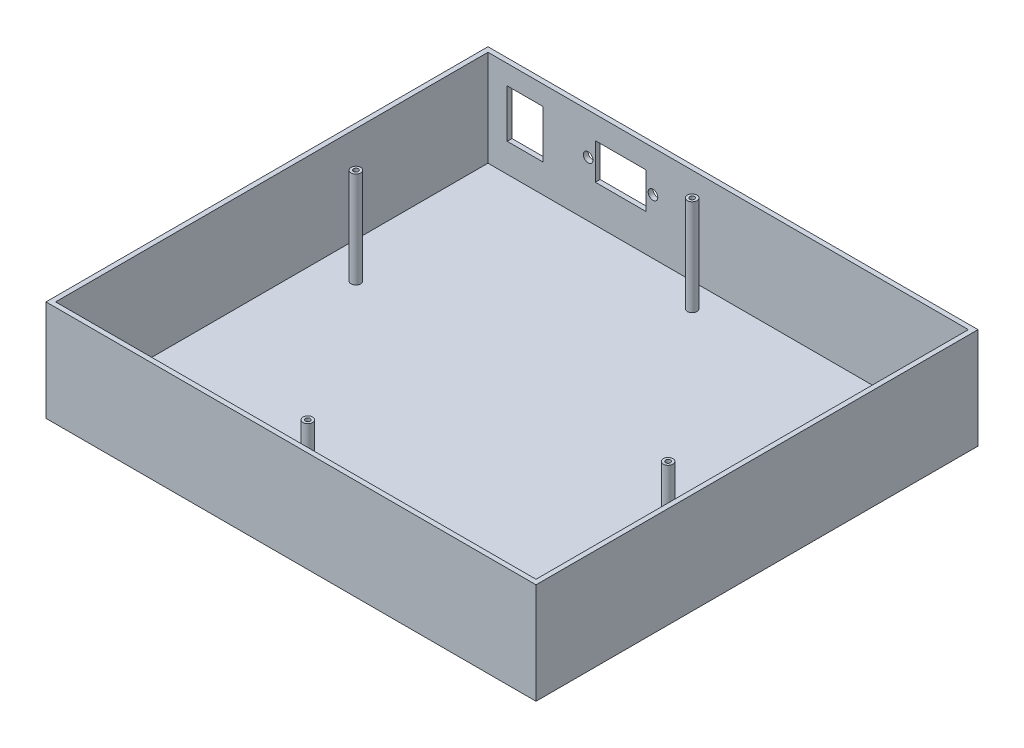
ISO-10303-21;
HEADER;
FILE_DESCRIPTION(('STEP AP214'),'2;1');
FILE_NAME('part.step','',(''),(''),'','','');
FILE_SCHEMA(('AUTOMOTIVE_DESIGN { 1 0 10303 214 1 1 1 1 }'));
ENDSEC;
DATA;
#1=APPLICATION_CONTEXT('core data for automotive mechanical design processes');
#2=APPLICATION_PROTOCOL_DEFINITION('international standard','automotive_design',2000,#1);
#3=PRODUCT_CONTEXT('',#1,'mechanical');
#4=PRODUCT('Part','Part','',(#3));
#5=PRODUCT_RELATED_PRODUCT_CATEGORY('part','',(#4));
#6=PRODUCT_DEFINITION_FORMATION('','',#4);
#7=PRODUCT_DEFINITION_CONTEXT('part definition',#1,'design');
#8=PRODUCT_DEFINITION('design','',#6,#7);
#9=PRODUCT_DEFINITION_SHAPE('','',#8);
#10=(LENGTH_UNIT() NAMED_UNIT(*) SI_UNIT(.MILLI.,.METRE.));
#11=(NAMED_UNIT(*) PLANE_ANGLE_UNIT() SI_UNIT($,.RADIAN.));
#12=(NAMED_UNIT(*) SI_UNIT($,.STERADIAN.) SOLID_ANGLE_UNIT());
#13=UNCERTAINTY_MEASURE_WITH_UNIT(LENGTH_MEASURE(1.E-05),#10,'distance_accuracy_value','');
#14=(GEOMETRIC_REPRESENTATION_CONTEXT(3) GLOBAL_UNCERTAINTY_ASSIGNED_CONTEXT((#13)) GLOBAL_UNIT_ASSIGNED_CONTEXT((#10,
#11,#12)) REPRESENTATION_CONTEXT('',''));
#15=CARTESIAN_POINT('',(0.,0.,0.));
#16=DIRECTION('',(0.,0.,1.));
#17=DIRECTION('',(1.,0.,0.));
#18=AXIS2_PLACEMENT_3D('',#15,#16,#17);
#19=CARTESIAN_POINT('',(0.,2.,0.));
#20=DIRECTION('',(0.,-1.,0.));
#21=DIRECTION('',(0.,0.,-1.));
#22=AXIS2_PLACEMENT_3D('',#19,#20,#21);
#23=PLANE('',#22);
#24=CARTESIAN_POINT('',(-85.,2.,-20.));
#25=DIRECTION('',(0.,-1.,0.));
#26=DIRECTION('',(0.,0.,-1.));
#27=AXIS2_PLACEMENT_3D('',#24,#25,#26);
#28=CIRCLE('',#27,2.);
#29=CARTESIAN_POINT('',(-85.,2.,-22.));
#30=VERTEX_POINT('',#29);
#31=EDGE_CURVE('E11',#30,#30,#28,.F.);
#32=ORIENTED_EDGE('',*,*,#31,.F.);
#33=EDGE_LOOP('',(#32));
#34=FACE_BOUND('',#33,.T.);
#35=CARTESIAN_POINT('',(85.0000000000001,2.,20.));
#36=DIRECTION('',(0.,-1.,0.));
#37=DIRECTION('',(0.,0.,-1.));
#38=AXIS2_PLACEMENT_3D('',#35,#36,#37);
#39=CIRCLE('',#38,2.);
#40=CARTESIAN_POINT('',(85.0000000000001,2.,18.));
#41=VERTEX_POINT('',#40);
#42=EDGE_CURVE('E48',#41,#41,#39,.F.);
#43=ORIENTED_EDGE('',*,*,#42,.F.);
#44=EDGE_LOOP('',(#43));
#45=FACE_BOUND('',#44,.T.);
#46=CARTESIAN_POINT('',(-4.99999999999998,2.,-80.));
#47=DIRECTION('',(0.,-1.,0.));
#48=DIRECTION('',(0.,0.,-1.));
#49=AXIS2_PLACEMENT_3D('',#46,#47,#48);
#50=CIRCLE('',#49,2.);
#51=CARTESIAN_POINT('',(-4.99999999999998,2.,-82.));
#52=VERTEX_POINT('',#51);
#53=EDGE_CURVE('E400',#52,#52,#50,.F.);
#54=ORIENTED_EDGE('',*,*,#53,.F.);
#55=EDGE_LOOP('',(#54));
#56=FACE_BOUND('',#55,.T.);
#57=CARTESIAN_POINT('',(-4.99999999999998,2.,80.));
#58=DIRECTION('',(0.,-1.,0.));
#59=DIRECTION('',(0.,0.,-1.));
#60=AXIS2_PLACEMENT_3D('',#57,#58,#59);
#61=CIRCLE('',#60,2.);
#62=CARTESIAN_POINT('',(-4.99999999999998,2.,78.));
#63=VERTEX_POINT('',#62);
#64=EDGE_CURVE('E396',#63,#63,#61,.F.);
#65=ORIENTED_EDGE('',*,*,#64,.F.);
#66=EDGE_LOOP('',(#65));
#67=FACE_BOUND('',#66,.T.);
#68=DIRECTION('',(1.,0.,0.));
#69=VECTOR('',#68,1.);
#70=CARTESIAN_POINT('',(-100.,2.,90.));
#71=LINE('',#70,#69);
#72=CARTESIAN_POINT('',(-100.,2.00000000000002,90.));
#73=VERTEX_POINT('',#72);
#74=CARTESIAN_POINT('',(100.,2.,90.));
#75=VERTEX_POINT('',#74);
#76=EDGE_CURVE('E381',#73,#75,#71,.T.);
#77=ORIENTED_EDGE('',*,*,#76,.T.);
#78=DIRECTION('',(0.,0.,1.));
#79=VECTOR('',#78,1.);
#80=CARTESIAN_POINT('',(100.,2.,-90.));
#81=LINE('',#80,#79);
#82=CARTESIAN_POINT('',(100.,2.00000000000002,-90.));
#83=VERTEX_POINT('',#82);
#84=EDGE_CURVE('E385',#83,#75,#81,.T.);
#85=ORIENTED_EDGE('',*,*,#84,.F.);
#86=DIRECTION('',(1.,0.,0.));
#87=VECTOR('',#86,1.);
#88=CARTESIAN_POINT('',(-100.,2.,-90.));
#89=LINE('',#88,#87);
#90=CARTESIAN_POINT('',(-100.,2.00000000000002,-90.));
#91=VERTEX_POINT('',#90);
#92=EDGE_CURVE('E389',#91,#83,#89,.T.);
#93=ORIENTED_EDGE('',*,*,#92,.F.);
#94=DIRECTION('',(0.,0.,1.));
#95=VECTOR('',#94,1.);
#96=CARTESIAN_POINT('',(-100.,2.,-90.));
#97=LINE('',#96,#95);
#98=EDGE_CURVE('E392',#91,#73,#97,.T.);
#99=ORIENTED_EDGE('',*,*,#98,.T.);
#100=EDGE_LOOP('',(#77,#85,#93,#99));
#101=FACE_BOUND('',#100,.T.);
#102=ADVANCED_FACE('F39',(#34,#45,#56,#67,#101),#23,.F.);
#103=CARTESIAN_POINT('',(100.,42.,-90.));
#104=DIRECTION('',(-1.,0.,0.));
#105=DIRECTION('',(0.,0.,1.));
#106=AXIS2_PLACEMENT_3D('',#103,#104,#105);
#107=PLANE('',#106);
#108=ORIENTED_EDGE('',*,*,#84,.T.);
#109=DIRECTION('',(0.,-1.,0.));
#110=VECTOR('',#109,1.);
#111=CARTESIAN_POINT('',(100.,42.,90.));
#112=LINE('',#111,#110);
#113=CARTESIAN_POINT('',(100.,42.,90.));
#114=VERTEX_POINT('',#113);
#115=EDGE_CURVE('E324',#114,#75,#112,.T.);
#116=ORIENTED_EDGE('',*,*,#115,.F.);
#117=DIRECTION('',(0.,0.,-1.));
#118=VECTOR('',#117,1.);
#119=CARTESIAN_POINT('',(100.,42.,-90.));
#120=LINE('',#119,#118);
#121=CARTESIAN_POINT('',(100.,42.,-90.));
#122=VERTEX_POINT('',#121);
#123=EDGE_CURVE('E311',#114,#122,#120,.T.);
#124=ORIENTED_EDGE('',*,*,#123,.T.);
#125=DIRECTION('',(0.,-1.,0.));
#126=VECTOR('',#125,1.);
#127=CARTESIAN_POINT('',(100.,42.,-90.));
#128=LINE('',#127,#126);
#129=EDGE_CURVE('E335',#122,#83,#128,.T.);
#130=ORIENTED_EDGE('',*,*,#129,.T.);
#131=EDGE_LOOP('',(#108,#116,#124,#130));
#132=FACE_BOUND('',#131,.T.);
#133=ADVANCED_FACE('F411',(#132),#107,.T.);
#134=CARTESIAN_POINT('',(-100.,42.,-90.));
#135=DIRECTION('',(0.,0.,1.));
#136=DIRECTION('',(1.,0.,0.));
#137=AXIS2_PLACEMENT_3D('',#134,#135,#136);
#138=PLANE('',#137);
#139=DIRECTION('',(0.,1.,0.));
#140=VECTOR('',#139,1.);
#141=CARTESIAN_POINT('',(-92.,33.8937497620596,-90.));
#142=LINE('',#141,#140);
#143=CARTESIAN_POINT('',(-92.,13.8937497620596,-90.));
#144=VERTEX_POINT('',#143);
#145=CARTESIAN_POINT('',(-92.,33.8937497620596,-90.));
#146=VERTEX_POINT('',#145);
#147=EDGE_CURVE('E157',#144,#146,#142,.T.);
#148=ORIENTED_EDGE('',*,*,#147,.T.);
#149=DIRECTION('',(1.,0.,0.));
#150=VECTOR('',#149,1.);
#151=CARTESIAN_POINT('',(-77.,33.8937497620596,-90.));
#152=LINE('',#151,#150);
#153=CARTESIAN_POINT('',(-77.,33.8937497620596,-90.));
#154=VERTEX_POINT('',#153);
#155=EDGE_CURVE('E169',#146,#154,#152,.T.);
#156=ORIENTED_EDGE('',*,*,#155,.T.);
#157=DIRECTION('',(0.,-1.,0.));
#158=VECTOR('',#157,1.);
#159=CARTESIAN_POINT('',(-77.,33.8937497620596,-90.));
#160=LINE('',#159,#158);
#161=CARTESIAN_POINT('',(-77.,13.8937497620596,-90.));
#162=VERTEX_POINT('',#161);
#163=EDGE_CURVE('E55',#154,#162,#160,.T.);
#164=ORIENTED_EDGE('',*,*,#163,.T.);
#165=DIRECTION('',(-1.,0.,0.));
#166=VECTOR('',#165,1.);
#167=CARTESIAN_POINT('',(-77.,13.8937497620596,-90.));
#168=LINE('',#167,#166);
#169=EDGE_CURVE('E166',#162,#144,#168,.T.);
#170=ORIENTED_EDGE('',*,*,#169,.T.);
#171=EDGE_LOOP('',(#148,#156,#164,#170));
#172=FACE_BOUND('',#171,.T.);
#173=DIRECTION('',(0.,1.,0.));
#174=VECTOR('',#173,1.);
#175=CARTESIAN_POINT('',(-55.3114303352729,32.4786714741235,-90.));
#176=LINE('',#175,#174);
#177=CARTESIAN_POINT('',(-55.3114303352729,17.4786714741235,-90.));
#178=VERTEX_POINT('',#177);
#179=CARTESIAN_POINT('',(-55.3114303352729,32.4786714741235,-90.));
#180=VERTEX_POINT('',#179);
#181=EDGE_CURVE('E207',#178,#180,#176,.T.);
#182=ORIENTED_EDGE('',*,*,#181,.T.);
#183=DIRECTION('',(1.,0.,0.));
#184=VECTOR('',#183,1.);
#185=CARTESIAN_POINT('',(-34.3114303352728,32.4786714741235,-90.));
#186=LINE('',#185,#184);
#187=CARTESIAN_POINT('',(-34.3114303352728,32.4786714741235,-90.));
#188=VERTEX_POINT('',#187);
#189=EDGE_CURVE('E211',#180,#188,#186,.T.);
#190=ORIENTED_EDGE('',*,*,#189,.T.);
#191=DIRECTION('',(0.,-1.,0.));
#192=VECTOR('',#191,1.);
#193=CARTESIAN_POINT('',(-34.3114303352728,32.4786714741235,-90.));
#194=LINE('',#193,#192);
#195=CARTESIAN_POINT('',(-34.3114303352729,17.4786714741235,-90.));
#196=VERTEX_POINT('',#195);
#197=EDGE_CURVE('E63',#188,#196,#194,.T.);
#198=ORIENTED_EDGE('',*,*,#197,.T.);
#199=DIRECTION('',(-1.,0.,0.));
#200=VECTOR('',#199,1.);
#201=CARTESIAN_POINT('',(-34.3114303352729,17.4786714741235,-90.));
#202=LINE('',#201,#200);
#203=EDGE_CURVE('E218',#196,#178,#202,.T.);
#204=ORIENTED_EDGE('',*,*,#203,.T.);
#205=EDGE_LOOP('',(#182,#190,#198,#204));
#206=FACE_BOUND('',#205,.T.);
#207=CARTESIAN_POINT('',(-58.3114303352729,24.9786714741235,-90.));
#208=DIRECTION('',(0.,0.,-1.));
#209=DIRECTION('',(-1.,0.,0.));
#210=AXIS2_PLACEMENT_3D('',#207,#208,#209);
#211=CIRCLE('',#210,2.);
#212=CARTESIAN_POINT('',(-60.3114303352729,24.9786714741235,-90.));
#213=VERTEX_POINT('',#212);
#214=EDGE_CURVE('E227',#213,#213,#211,.T.);
#215=ORIENTED_EDGE('',*,*,#214,.T.);
#216=EDGE_LOOP('',(#215));
#217=FACE_BOUND('',#216,.T.);
#218=CARTESIAN_POINT('',(-31.3114303352729,24.9786714741235,-90.));
#219=DIRECTION('',(0.,0.,-1.));
#220=DIRECTION('',(-1.,0.,0.));
#221=AXIS2_PLACEMENT_3D('',#218,#219,#220);
#222=CIRCLE('',#221,2.);
#223=CARTESIAN_POINT('',(-33.3114303352729,24.9786714741235,-90.));
#224=VERTEX_POINT('',#223);
#225=EDGE_CURVE('E256',#224,#224,#222,.T.);
#226=ORIENTED_EDGE('',*,*,#225,.T.);
#227=EDGE_LOOP('',(#226));
#228=FACE_BOUND('',#227,.T.);
#229=ORIENTED_EDGE('',*,*,#92,.T.);
#230=ORIENTED_EDGE('',*,*,#129,.F.);
#231=DIRECTION('',(-1.,0.,0.));
#232=VECTOR('',#231,1.);
#233=CARTESIAN_POINT('',(-100.,42.,-90.));
#234=LINE('',#233,#232);
#235=CARTESIAN_POINT('',(-100.,42.,-90.));
#236=VERTEX_POINT('',#235);
#237=EDGE_CURVE('E314',#122,#236,#234,.T.);
#238=ORIENTED_EDGE('',*,*,#237,.T.);
#239=DIRECTION('',(0.,-1.,0.));
#240=VECTOR('',#239,1.);
#241=CARTESIAN_POINT('',(-100.,42.,-90.));
#242=LINE('',#241,#240);
#243=EDGE_CURVE('E331',#236,#91,#242,.T.);
#244=ORIENTED_EDGE('',*,*,#243,.T.);
#245=EDGE_LOOP('',(#229,#230,#238,#244));
#246=FACE_BOUND('',#245,.T.);
#247=ADVANCED_FACE('F174',(#172,#206,#217,#228,#246),#138,.T.);
#248=CARTESIAN_POINT('',(-100.,42.,-90.));
#249=DIRECTION('',(1.,0.,0.));
#250=DIRECTION('',(0.,0.,-1.));
#251=AXIS2_PLACEMENT_3D('',#248,#249,#250);
#252=PLANE('',#251);
#253=ORIENTED_EDGE('',*,*,#98,.F.);
#254=ORIENTED_EDGE('',*,*,#243,.F.);
#255=DIRECTION('',(0.,0.,1.));
#256=VECTOR('',#255,1.);
#257=CARTESIAN_POINT('',(-100.,42.,-90.));
#258=LINE('',#257,#256);
#259=CARTESIAN_POINT('',(-100.,42.,90.));
#260=VERTEX_POINT('',#259);
#261=EDGE_CURVE('E317',#236,#260,#258,.T.);
#262=ORIENTED_EDGE('',*,*,#261,.T.);
#263=DIRECTION('',(0.,-1.,0.));
#264=VECTOR('',#263,1.);
#265=CARTESIAN_POINT('',(-100.,42.,90.));
#266=LINE('',#265,#264);
#267=EDGE_CURVE('E327',#260,#73,#266,.T.);
#268=ORIENTED_EDGE('',*,*,#267,.T.);
#269=EDGE_LOOP('',(#253,#254,#262,#268));
#270=FACE_BOUND('',#269,.T.);
#271=ADVANCED_FACE('F423',(#270),#252,.T.);
#272=CARTESIAN_POINT('',(-100.,42.,90.));
#273=DIRECTION('',(0.,0.,-1.));
#274=DIRECTION('',(-1.,0.,0.));
#275=AXIS2_PLACEMENT_3D('',#272,#273,#274);
#276=PLANE('',#275);
#277=ORIENTED_EDGE('',*,*,#76,.F.);
#278=ORIENTED_EDGE('',*,*,#267,.F.);
#279=DIRECTION('',(1.,0.,0.));
#280=VECTOR('',#279,1.);
#281=CARTESIAN_POINT('',(-100.,42.,90.));
#282=LINE('',#281,#280);
#283=EDGE_CURVE('E321',#260,#114,#282,.T.);
#284=ORIENTED_EDGE('',*,*,#283,.T.);
#285=ORIENTED_EDGE('',*,*,#115,.T.);
#286=EDGE_LOOP('',(#277,#278,#284,#285));
#287=FACE_BOUND('',#286,.T.);
#288=ADVANCED_FACE('F420',(#287),#276,.T.);
#289=CARTESIAN_POINT('',(0.,42.,0.));
#290=DIRECTION('',(0.,1.,0.));
#291=DIRECTION('',(0.,0.,1.));
#292=AXIS2_PLACEMENT_3D('',#289,#290,#291);
#293=PLANE('',#292);
#294=DIRECTION('',(0.,0.,-1.));
#295=VECTOR('',#294,1.);
#296=CARTESIAN_POINT('',(102.,42.,-92.));
#297=LINE('',#296,#295);
#298=CARTESIAN_POINT('',(102.,42.,92.));
#299=VERTEX_POINT('',#298);
#300=CARTESIAN_POINT('',(102.,42.,-92.));
#301=VERTEX_POINT('',#300);
#302=EDGE_CURVE('E340',#299,#301,#297,.T.);
#303=ORIENTED_EDGE('',*,*,#302,.T.);
#304=DIRECTION('',(-1.,0.,0.));
#305=VECTOR('',#304,1.);
#306=CARTESIAN_POINT('',(-102.,42.,-92.));
#307=LINE('',#306,#305);
#308=CARTESIAN_POINT('',(-102.,42.,-92.));
#309=VERTEX_POINT('',#308);
#310=EDGE_CURVE('E344',#301,#309,#307,.T.);
#311=ORIENTED_EDGE('',*,*,#310,.T.);
#312=DIRECTION('',(0.,0.,1.));
#313=VECTOR('',#312,1.);
#314=CARTESIAN_POINT('',(-102.,42.,-92.));
#315=LINE('',#314,#313);
#316=CARTESIAN_POINT('',(-102.,42.,92.));
#317=VERTEX_POINT('',#316);
#318=EDGE_CURVE('E348',#309,#317,#315,.T.);
#319=ORIENTED_EDGE('',*,*,#318,.T.);
#320=DIRECTION('',(1.,0.,0.));
#321=VECTOR('',#320,1.);
#322=CARTESIAN_POINT('',(-102.,42.,92.));
#323=LINE('',#322,#321);
#324=EDGE_CURVE('E351',#317,#299,#323,.T.);
#325=ORIENTED_EDGE('',*,*,#324,.T.);
#326=EDGE_LOOP('',(#303,#311,#319,#325));
#327=FACE_BOUND('',#326,.T.);
#328=ORIENTED_EDGE('',*,*,#237,.F.);
#329=ORIENTED_EDGE('',*,*,#123,.F.);
#330=ORIENTED_EDGE('',*,*,#283,.F.);
#331=ORIENTED_EDGE('',*,*,#261,.F.);
#332=EDGE_LOOP('',(#328,#329,#330,#331));
#333=FACE_BOUND('',#332,.T.);
#334=ADVANCED_FACE('F430',(#327,#333),#293,.T.);
#335=CARTESIAN_POINT('',(102.,42.,-92.));
#336=DIRECTION('',(-1.,0.,0.));
#337=DIRECTION('',(0.,0.,1.));
#338=AXIS2_PLACEMENT_3D('',#335,#336,#337);
#339=PLANE('',#338);
#340=DIRECTION('',(0.,0.,-1.));
#341=VECTOR('',#340,1.);
#342=CARTESIAN_POINT('',(102.,0.,-92.));
#343=LINE('',#342,#341);
#344=CARTESIAN_POINT('',(102.,0.,92.));
#345=VERTEX_POINT('',#344);
#346=CARTESIAN_POINT('',(102.,0.,-92.));
#347=VERTEX_POINT('',#346);
#348=EDGE_CURVE('E339',#345,#347,#343,.T.);
#349=ORIENTED_EDGE('',*,*,#348,.T.);
#350=DIRECTION('',(0.,-1.,0.));
#351=VECTOR('',#350,1.);
#352=CARTESIAN_POINT('',(102.,42.,-92.));
#353=LINE('',#352,#351);
#354=EDGE_CURVE('E377',#301,#347,#353,.T.);
#355=ORIENTED_EDGE('',*,*,#354,.F.);
#356=ORIENTED_EDGE('',*,*,#302,.F.);
#357=DIRECTION('',(0.,-1.,0.));
#358=VECTOR('',#357,1.);
#359=CARTESIAN_POINT('',(102.,42.,92.));
#360=LINE('',#359,#358);
#361=EDGE_CURVE('E354',#299,#345,#360,.T.);
#362=ORIENTED_EDGE('',*,*,#361,.T.);
#363=EDGE_LOOP('',(#349,#355,#356,#362));
#364=FACE_BOUND('',#363,.T.);
#365=ADVANCED_FACE('F446',(#364),#339,.F.);
#366=CARTESIAN_POINT('',(-102.,42.,-92.));
#367=DIRECTION('',(0.,0.,1.));
#368=DIRECTION('',(1.,0.,0.));
#369=AXIS2_PLACEMENT_3D('',#366,#367,#368);
#370=PLANE('',#369);
#371=DIRECTION('',(1.,0.,0.));
#372=VECTOR('',#371,1.);
#373=CARTESIAN_POINT('',(-77.,33.8937497620596,-92.));
#374=LINE('',#373,#372);
#375=CARTESIAN_POINT('',(-92.,33.8937497620596,-92.));
#376=VERTEX_POINT('',#375);
#377=CARTESIAN_POINT('',(-77.,33.8937497620596,-92.));
#378=VERTEX_POINT('',#377);
#379=EDGE_CURVE('E191',#376,#378,#374,.T.);
#380=ORIENTED_EDGE('',*,*,#379,.F.);
#381=DIRECTION('',(0.,1.,0.));
#382=VECTOR('',#381,1.);
#383=CARTESIAN_POINT('',(-92.,33.8937497620596,-92.));
#384=LINE('',#383,#382);
#385=CARTESIAN_POINT('',(-92.,13.8937497620596,-92.));
#386=VERTEX_POINT('',#385);
#387=EDGE_CURVE('E160',#386,#376,#384,.T.);
#388=ORIENTED_EDGE('',*,*,#387,.F.);
#389=DIRECTION('',(-1.,0.,0.));
#390=VECTOR('',#389,1.);
#391=CARTESIAN_POINT('',(-77.,13.8937497620596,-92.));
#392=LINE('',#391,#390);
#393=CARTESIAN_POINT('',(-77.,13.8937497620596,-92.));
#394=VERTEX_POINT('',#393);
#395=EDGE_CURVE('E178',#394,#386,#392,.T.);
#396=ORIENTED_EDGE('',*,*,#395,.F.);
#397=DIRECTION('',(0.,-1.,0.));
#398=VECTOR('',#397,1.);
#399=CARTESIAN_POINT('',(-77.,33.8937497620596,-92.));
#400=LINE('',#399,#398);
#401=EDGE_CURVE('E182',#378,#394,#400,.T.);
#402=ORIENTED_EDGE('',*,*,#401,.F.);
#403=EDGE_LOOP('',(#380,#388,#396,#402));
#404=FACE_BOUND('',#403,.T.);
#405=DIRECTION('',(1.,0.,0.));
#406=VECTOR('',#405,1.);
#407=CARTESIAN_POINT('',(-34.3114303352728,32.4786714741235,-92.));
#408=LINE('',#407,#406);
#409=CARTESIAN_POINT('',(-55.3114303352729,32.4786714741235,-92.));
#410=VERTEX_POINT('',#409);
#411=CARTESIAN_POINT('',(-34.3114303352728,32.4786714741235,-92.));
#412=VERTEX_POINT('',#411);
#413=EDGE_CURVE('E226',#410,#412,#408,.T.);
#414=ORIENTED_EDGE('',*,*,#413,.F.);
#415=DIRECTION('',(0.,1.,0.));
#416=VECTOR('',#415,1.);
#417=CARTESIAN_POINT('',(-55.3114303352729,32.4786714741235,-92.));
#418=LINE('',#417,#416);
#419=CARTESIAN_POINT('',(-55.3114303352729,17.4786714741235,-92.));
#420=VERTEX_POINT('',#419);
#421=EDGE_CURVE('E223',#420,#410,#418,.T.);
#422=ORIENTED_EDGE('',*,*,#421,.F.);
#423=DIRECTION('',(-1.,0.,0.));
#424=VECTOR('',#423,1.);
#425=CARTESIAN_POINT('',(-34.3114303352729,17.4786714741235,-92.));
#426=LINE('',#425,#424);
#427=CARTESIAN_POINT('',(-34.3114303352729,17.4786714741235,-92.));
#428=VERTEX_POINT('',#427);
#429=EDGE_CURVE('E212',#428,#420,#426,.T.);
#430=ORIENTED_EDGE('',*,*,#429,.F.);
#431=DIRECTION('',(0.,-1.,0.));
#432=VECTOR('',#431,1.);
#433=CARTESIAN_POINT('',(-34.3114303352728,32.4786714741235,-92.));
#434=LINE('',#433,#432);
#435=EDGE_CURVE('E231',#412,#428,#434,.T.);
#436=ORIENTED_EDGE('',*,*,#435,.F.);
#437=EDGE_LOOP('',(#414,#422,#430,#436));
#438=FACE_BOUND('',#437,.T.);
#439=CARTESIAN_POINT('',(-58.3114303352729,24.9786714741235,-92.));
#440=DIRECTION('',(0.,0.,-1.));
#441=DIRECTION('',(-1.,0.,0.));
#442=AXIS2_PLACEMENT_3D('',#439,#440,#441);
#443=CIRCLE('',#442,2.);
#444=CARTESIAN_POINT('',(-60.3114303352729,24.9786714741235,-92.));
#445=VERTEX_POINT('',#444);
#446=EDGE_CURVE('E252',#445,#445,#443,.T.);
#447=ORIENTED_EDGE('',*,*,#446,.F.);
#448=EDGE_LOOP('',(#447));
#449=FACE_BOUND('',#448,.T.);
#450=CARTESIAN_POINT('',(-31.3114303352729,24.9786714741235,-92.));
#451=DIRECTION('',(0.,0.,-1.));
#452=DIRECTION('',(-1.,0.,0.));
#453=AXIS2_PLACEMENT_3D('',#450,#451,#452);
#454=CIRCLE('',#453,2.);
#455=CARTESIAN_POINT('',(-33.3114303352729,24.9786714741235,-92.));
#456=VERTEX_POINT('',#455);
#457=EDGE_CURVE('E260',#456,#456,#454,.T.);
#458=ORIENTED_EDGE('',*,*,#457,.F.);
#459=EDGE_LOOP('',(#458));
#460=FACE_BOUND('',#459,.T.);
#461=DIRECTION('',(-1.,0.,0.));
#462=VECTOR('',#461,1.);
#463=CARTESIAN_POINT('',(-102.,0.,-92.));
#464=LINE('',#463,#462);
#465=CARTESIAN_POINT('',(-102.,0.,-92.));
#466=VERTEX_POINT('',#465);
#467=EDGE_CURVE('E358',#347,#466,#464,.T.);
#468=ORIENTED_EDGE('',*,*,#467,.T.);
#469=DIRECTION('',(0.,-1.,0.));
#470=VECTOR('',#469,1.);
#471=CARTESIAN_POINT('',(-102.,42.,-92.));
#472=LINE('',#471,#470);
#473=EDGE_CURVE('E373',#309,#466,#472,.T.);
#474=ORIENTED_EDGE('',*,*,#473,.F.);
#475=ORIENTED_EDGE('',*,*,#310,.F.);
#476=ORIENTED_EDGE('',*,*,#354,.T.);
#477=EDGE_LOOP('',(#468,#474,#475,#476));
#478=FACE_BOUND('',#477,.T.);
#479=ADVANCED_FACE('F455',(#404,#438,#449,#460,#478),#370,.F.);
#480=CARTESIAN_POINT('',(-102.,42.,-92.));
#481=DIRECTION('',(1.,0.,0.));
#482=DIRECTION('',(0.,0.,-1.));
#483=AXIS2_PLACEMENT_3D('',#480,#481,#482);
#484=PLANE('',#483);
#485=DIRECTION('',(0.,0.,1.));
#486=VECTOR('',#485,1.);
#487=CARTESIAN_POINT('',(-102.,0.,-92.));
#488=LINE('',#487,#486);
#489=CARTESIAN_POINT('',(-102.,0.,92.));
#490=VERTEX_POINT('',#489);
#491=EDGE_CURVE('E361',#466,#490,#488,.T.);
#492=ORIENTED_EDGE('',*,*,#491,.T.);
#493=DIRECTION('',(0.,-1.,0.));
#494=VECTOR('',#493,1.);
#495=CARTESIAN_POINT('',(-102.,42.,92.));
#496=LINE('',#495,#494);
#497=EDGE_CURVE('E369',#317,#490,#496,.T.);
#498=ORIENTED_EDGE('',*,*,#497,.F.);
#499=ORIENTED_EDGE('',*,*,#318,.F.);
#500=ORIENTED_EDGE('',*,*,#473,.T.);
#501=EDGE_LOOP('',(#492,#498,#499,#500));
#502=FACE_BOUND('',#501,.T.);
#503=ADVANCED_FACE('F451',(#502),#484,.F.);
#504=CARTESIAN_POINT('',(-102.,42.,92.));
#505=DIRECTION('',(0.,0.,-1.));
#506=DIRECTION('',(-1.,0.,0.));
#507=AXIS2_PLACEMENT_3D('',#504,#505,#506);
#508=PLANE('',#507);
#509=DIRECTION('',(1.,0.,0.));
#510=VECTOR('',#509,1.);
#511=CARTESIAN_POINT('',(-102.,0.,92.));
#512=LINE('',#511,#510);
#513=EDGE_CURVE('E345',#490,#345,#512,.T.);
#514=ORIENTED_EDGE('',*,*,#513,.T.);
#515=ORIENTED_EDGE('',*,*,#361,.F.);
#516=ORIENTED_EDGE('',*,*,#324,.F.);
#517=ORIENTED_EDGE('',*,*,#497,.T.);
#518=EDGE_LOOP('',(#514,#515,#516,#517));
#519=FACE_BOUND('',#518,.T.);
#520=ADVANCED_FACE('F448',(#519),#508,.F.);
#521=CARTESIAN_POINT('',(0.,0.,0.));
#522=DIRECTION('',(0.,-1.,0.));
#523=DIRECTION('',(0.,0.,-1.));
#524=AXIS2_PLACEMENT_3D('',#521,#522,#523);
#525=PLANE('',#524);
#526=ORIENTED_EDGE('',*,*,#348,.F.);
#527=ORIENTED_EDGE('',*,*,#513,.F.);
#528=ORIENTED_EDGE('',*,*,#491,.F.);
#529=ORIENTED_EDGE('',*,*,#467,.F.);
#530=EDGE_LOOP('',(#526,#527,#528,#529));
#531=FACE_BOUND('',#530,.T.);
#532=ADVANCED_FACE('F41',(#531),#525,.T.);
#533=CARTESIAN_POINT('',(-4.99999999999998,42.,80.));
#534=DIRECTION('',(0.,-1.,0.));
#535=DIRECTION('',(0.,0.,-1.));
#536=AXIS2_PLACEMENT_3D('',#533,#534,#535);
#537=CYLINDRICAL_SURFACE('',#536,2.);
#538=CARTESIAN_POINT('',(-4.99999999999998,42.,80.));
#539=DIRECTION('',(0.,1.,0.));
#540=DIRECTION('',(0.,0.,1.));
#541=AXIS2_PLACEMENT_3D('',#538,#539,#540);
#542=CIRCLE('',#541,2.);
#543=CARTESIAN_POINT('',(-4.99999999999998,42.,82.));
#544=VERTEX_POINT('',#543);
#545=EDGE_CURVE('E307',#544,#544,#542,.T.);
#546=ORIENTED_EDGE('',*,*,#545,.F.);
#547=EDGE_LOOP('',(#546));
#548=FACE_BOUND('',#547,.T.);
#549=ORIENTED_EDGE('',*,*,#64,.T.);
#550=EDGE_LOOP('',(#549));
#551=FACE_BOUND('',#550,.T.);
#552=ADVANCED_FACE('F477',(#548,#551),#537,.T.);
#553=CARTESIAN_POINT('',(-4.99999999999998,42.,80.));
#554=DIRECTION('',(0.,1.,0.));
#555=DIRECTION('',(0.,0.,1.));
#556=AXIS2_PLACEMENT_3D('',#553,#554,#555);
#557=PLANE('',#556);
#558=CARTESIAN_POINT('',(-4.99999999999998,42.,80.));
#559=DIRECTION('',(0.,1.,0.));
#560=DIRECTION('',(0.,0.,1.));
#561=AXIS2_PLACEMENT_3D('',#558,#559,#560);
#562=CIRCLE('',#561,1.);
#563=CARTESIAN_POINT('',(-4.99999999999998,42.,81.));
#564=VERTEX_POINT('',#563);
#565=EDGE_CURVE('E285',#564,#564,#562,.T.);
#566=ORIENTED_EDGE('',*,*,#565,.F.);
#567=EDGE_LOOP('',(#566));
#568=FACE_BOUND('',#567,.T.);
#569=ORIENTED_EDGE('',*,*,#545,.T.);
#570=EDGE_LOOP('',(#569));
#571=FACE_BOUND('',#570,.T.);
#572=ADVANCED_FACE('F481',(#568,#571),#557,.T.);
#573=CARTESIAN_POINT('',(-4.99999999999998,42.,-80.));
#574=DIRECTION('',(0.,-1.,0.));
#575=DIRECTION('',(0.,0.,-1.));
#576=AXIS2_PLACEMENT_3D('',#573,#574,#575);
#577=CYLINDRICAL_SURFACE('',#576,2.);
#578=CARTESIAN_POINT('',(-4.99999999999998,42.,-80.));
#579=DIRECTION('',(0.,1.,0.));
#580=DIRECTION('',(0.,0.,-1.));
#581=AXIS2_PLACEMENT_3D('',#578,#579,#580);
#582=CIRCLE('',#581,2.);
#583=CARTESIAN_POINT('',(-4.99999999999998,42.,-82.));
#584=VERTEX_POINT('',#583);
#585=EDGE_CURVE('E303',#584,#584,#582,.T.);
#586=ORIENTED_EDGE('',*,*,#585,.F.);
#587=EDGE_LOOP('',(#586));
#588=FACE_BOUND('',#587,.T.);
#589=ORIENTED_EDGE('',*,*,#53,.T.);
#590=EDGE_LOOP('',(#589));
#591=FACE_BOUND('',#590,.T.);
#592=ADVANCED_FACE('F487',(#588,#591),#577,.T.);
#593=CARTESIAN_POINT('',(-4.99999999999998,42.,-80.));
#594=DIRECTION('',(0.,-1.,0.));
#595=DIRECTION('',(0.,0.,-1.));
#596=AXIS2_PLACEMENT_3D('',#593,#594,#595);
#597=PLANE('',#596);
#598=CARTESIAN_POINT('',(-4.99999999999998,42.,-80.));
#599=DIRECTION('',(0.,1.,0.));
#600=DIRECTION('',(0.,0.,1.));
#601=AXIS2_PLACEMENT_3D('',#598,#599,#600);
#602=CIRCLE('',#601,1.);
#603=CARTESIAN_POINT('',(-4.99999999999998,42.,-79.));
#604=VERTEX_POINT('',#603);
#605=EDGE_CURVE('E269',#604,#604,#602,.T.);
#606=ORIENTED_EDGE('',*,*,#605,.F.);
#607=EDGE_LOOP('',(#606));
#608=FACE_BOUND('',#607,.T.);
#609=ORIENTED_EDGE('',*,*,#585,.T.);
#610=EDGE_LOOP('',(#609));
#611=FACE_BOUND('',#610,.T.);
#612=ADVANCED_FACE('F544',(#608,#611),#597,.F.);
#613=CARTESIAN_POINT('',(85.0000000000001,42.,20.));
#614=DIRECTION('',(0.,-1.,0.));
#615=DIRECTION('',(0.,0.,-1.));
#616=AXIS2_PLACEMENT_3D('',#613,#614,#615);
#617=CYLINDRICAL_SURFACE('',#616,2.);
#618=CARTESIAN_POINT('',(85.0000000000001,42.,20.));
#619=DIRECTION('',(0.,1.,0.));
#620=DIRECTION('',(0.,0.,1.));
#621=AXIS2_PLACEMENT_3D('',#618,#619,#620);
#622=CIRCLE('',#621,2.);
#623=CARTESIAN_POINT('',(85.0000000000001,42.,22.));
#624=VERTEX_POINT('',#623);
#625=EDGE_CURVE('E299',#624,#624,#622,.T.);
#626=ORIENTED_EDGE('',*,*,#625,.F.);
#627=EDGE_LOOP('',(#626));
#628=FACE_BOUND('',#627,.T.);
#629=ORIENTED_EDGE('',*,*,#42,.T.);
#630=EDGE_LOOP('',(#629));
#631=FACE_BOUND('',#630,.T.);
#632=ADVANCED_FACE('F407',(#628,#631),#617,.T.);
#633=CARTESIAN_POINT('',(85.0000000000001,42.,20.));
#634=DIRECTION('',(0.,1.,0.));
#635=DIRECTION('',(0.,0.,1.));
#636=AXIS2_PLACEMENT_3D('',#633,#634,#635);
#637=PLANE('',#636);
#638=CARTESIAN_POINT('',(85.0000000000001,42.,20.));
#639=DIRECTION('',(0.,1.,0.));
#640=DIRECTION('',(0.,0.,1.));
#641=AXIS2_PLACEMENT_3D('',#638,#639,#640);
#642=CIRCLE('',#641,0.999999999999998);
#643=CARTESIAN_POINT('',(85.0000000000001,42.,21.));
#644=VERTEX_POINT('',#643);
#645=EDGE_CURVE('E277',#644,#644,#642,.T.);
#646=ORIENTED_EDGE('',*,*,#645,.F.);
#647=EDGE_LOOP('',(#646));
#648=FACE_BOUND('',#647,.T.);
#649=ORIENTED_EDGE('',*,*,#625,.T.);
#650=EDGE_LOOP('',(#649));
#651=FACE_BOUND('',#650,.T.);
#652=ADVANCED_FACE('F555',(#648,#651),#637,.T.);
#653=CARTESIAN_POINT('',(-85.,42.,-20.));
#654=DIRECTION('',(0.,-1.,0.));
#655=DIRECTION('',(0.,0.,-1.));
#656=AXIS2_PLACEMENT_3D('',#653,#654,#655);
#657=CYLINDRICAL_SURFACE('',#656,2.);
#658=CARTESIAN_POINT('',(-85.,42.,-20.));
#659=DIRECTION('',(0.,1.,0.));
#660=DIRECTION('',(0.,0.,1.));
#661=AXIS2_PLACEMENT_3D('',#658,#659,#660);
#662=CIRCLE('',#661,2.);
#663=CARTESIAN_POINT('',(-85.,42.,-18.));
#664=VERTEX_POINT('',#663);
#665=EDGE_CURVE('E268',#664,#664,#662,.T.);
#666=ORIENTED_EDGE('',*,*,#665,.F.);
#667=EDGE_LOOP('',(#666));
#668=FACE_BOUND('',#667,.T.);
#669=ORIENTED_EDGE('',*,*,#31,.T.);
#670=EDGE_LOOP('',(#669));
#671=FACE_BOUND('',#670,.T.);
#672=ADVANCED_FACE('F563',(#668,#671),#657,.T.);
#673=CARTESIAN_POINT('',(-85.,42.,-20.));
#674=DIRECTION('',(0.,1.,0.));
#675=DIRECTION('',(0.,0.,1.));
#676=AXIS2_PLACEMENT_3D('',#673,#674,#675);
#677=PLANE('',#676);
#678=CARTESIAN_POINT('',(-85.,42.,-20.));
#679=DIRECTION('',(0.,1.,0.));
#680=DIRECTION('',(0.,0.,1.));
#681=AXIS2_PLACEMENT_3D('',#678,#679,#680);
#682=CIRCLE('',#681,0.999999999999998);
#683=CARTESIAN_POINT('',(-85.,42.,-19.));
#684=VERTEX_POINT('',#683);
#685=EDGE_CURVE('E201',#684,#684,#682,.T.);
#686=ORIENTED_EDGE('',*,*,#685,.F.);
#687=EDGE_LOOP('',(#686));
#688=FACE_BOUND('',#687,.T.);
#689=ORIENTED_EDGE('',*,*,#665,.T.);
#690=EDGE_LOOP('',(#689));
#691=FACE_BOUND('',#690,.T.);
#692=ADVANCED_FACE('F568',(#688,#691),#677,.T.);
#693=CARTESIAN_POINT('',(-85.,2.,-20.));
#694=DIRECTION('',(0.,1.,0.));
#695=DIRECTION('',(0.,0.,1.));
#696=AXIS2_PLACEMENT_3D('',#693,#694,#695);
#697=CYLINDRICAL_SURFACE('',#696,0.999999999999998);
#698=CARTESIAN_POINT('',(-85.,2.,-20.));
#699=DIRECTION('',(0.,1.,0.));
#700=DIRECTION('',(0.,0.,1.));
#701=AXIS2_PLACEMENT_3D('',#698,#699,#700);
#702=CIRCLE('',#701,0.999999999999998);
#703=CARTESIAN_POINT('',(-85.,2.,-19.));
#704=VERTEX_POINT('',#703);
#705=EDGE_CURVE('E289',#704,#704,#702,.T.);
#706=ORIENTED_EDGE('',*,*,#705,.F.);
#707=EDGE_LOOP('',(#706));
#708=FACE_BOUND('',#707,.T.);
#709=ORIENTED_EDGE('',*,*,#685,.T.);
#710=EDGE_LOOP('',(#709));
#711=FACE_BOUND('',#710,.T.);
#712=ADVANCED_FACE('F597',(#708,#711),#697,.F.);
#713=CARTESIAN_POINT('',(-85.,2.,-20.));
#714=DIRECTION('',(0.,1.,0.));
#715=DIRECTION('',(0.,0.,1.));
#716=AXIS2_PLACEMENT_3D('',#713,#714,#715);
#717=PLANE('',#716);
#718=ORIENTED_EDGE('',*,*,#705,.T.);
#719=EDGE_LOOP('',(#718));
#720=FACE_BOUND('',#719,.T.);
#721=ADVANCED_FACE('F607',(#720),#717,.T.);
#722=CARTESIAN_POINT('',(85.0000000000001,2.,20.));
#723=DIRECTION('',(0.,1.,0.));
#724=DIRECTION('',(0.,0.,1.));
#725=AXIS2_PLACEMENT_3D('',#722,#723,#724);
#726=CYLINDRICAL_SURFACE('',#725,0.999999999999998);
#727=CARTESIAN_POINT('',(85.0000000000001,2.,20.));
#728=DIRECTION('',(0.,1.,0.));
#729=DIRECTION('',(0.,0.,1.));
#730=AXIS2_PLACEMENT_3D('',#727,#728,#729);
#731=CIRCLE('',#730,0.999999999999998);
#732=CARTESIAN_POINT('',(85.0000000000001,2.,21.));
#733=VERTEX_POINT('',#732);
#734=EDGE_CURVE('E273',#733,#733,#731,.T.);
#735=ORIENTED_EDGE('',*,*,#734,.F.);
#736=EDGE_LOOP('',(#735));
#737=FACE_BOUND('',#736,.T.);
#738=ORIENTED_EDGE('',*,*,#645,.T.);
#739=EDGE_LOOP('',(#738));
#740=FACE_BOUND('',#739,.T.);
#741=ADVANCED_FACE('F617',(#737,#740),#726,.F.);
#742=CARTESIAN_POINT('',(85.0000000000001,2.,20.));
#743=DIRECTION('',(0.,1.,0.));
#744=DIRECTION('',(0.,0.,1.));
#745=AXIS2_PLACEMENT_3D('',#742,#743,#744);
#746=PLANE('',#745);
#747=ORIENTED_EDGE('',*,*,#734,.T.);
#748=EDGE_LOOP('',(#747));
#749=FACE_BOUND('',#748,.T.);
#750=ADVANCED_FACE('F627',(#749),#746,.T.);
#751=CARTESIAN_POINT('',(-4.99999999999998,2.,-80.));
#752=DIRECTION('',(0.,1.,0.));
#753=DIRECTION('',(0.,0.,1.));
#754=AXIS2_PLACEMENT_3D('',#751,#752,#753);
#755=CYLINDRICAL_SURFACE('',#754,1.);
#756=CARTESIAN_POINT('',(-4.99999999999998,2.,-80.));
#757=DIRECTION('',(0.,1.,0.));
#758=DIRECTION('',(0.,0.,1.));
#759=AXIS2_PLACEMENT_3D('',#756,#757,#758);
#760=CIRCLE('',#759,1.);
#761=CARTESIAN_POINT('',(-4.99999999999998,2.,-79.));
#762=VERTEX_POINT('',#761);
#763=EDGE_CURVE('E264',#762,#762,#760,.T.);
#764=ORIENTED_EDGE('',*,*,#763,.F.);
#765=EDGE_LOOP('',(#764));
#766=FACE_BOUND('',#765,.T.);
#767=ORIENTED_EDGE('',*,*,#605,.T.);
#768=EDGE_LOOP('',(#767));
#769=FACE_BOUND('',#768,.T.);
#770=ADVANCED_FACE('F637',(#766,#769),#755,.F.);
#771=CARTESIAN_POINT('',(-4.99999999999998,2.,-80.));
#772=DIRECTION('',(0.,1.,0.));
#773=DIRECTION('',(0.,0.,1.));
#774=AXIS2_PLACEMENT_3D('',#771,#772,#773);
#775=PLANE('',#774);
#776=ORIENTED_EDGE('',*,*,#763,.T.);
#777=EDGE_LOOP('',(#776));
#778=FACE_BOUND('',#777,.T.);
#779=ADVANCED_FACE('F647',(#778),#775,.T.);
#780=CARTESIAN_POINT('',(-4.99999999999998,2.,80.));
#781=DIRECTION('',(0.,1.,0.));
#782=DIRECTION('',(0.,0.,1.));
#783=AXIS2_PLACEMENT_3D('',#780,#781,#782);
#784=CYLINDRICAL_SURFACE('',#783,1.);
#785=CARTESIAN_POINT('',(-4.99999999999998,2.,80.));
#786=DIRECTION('',(0.,1.,0.));
#787=DIRECTION('',(0.,0.,1.));
#788=AXIS2_PLACEMENT_3D('',#785,#786,#787);
#789=CIRCLE('',#788,1.);
#790=CARTESIAN_POINT('',(-4.99999999999998,2.,81.));
#791=VERTEX_POINT('',#790);
#792=EDGE_CURVE('E281',#791,#791,#789,.T.);
#793=ORIENTED_EDGE('',*,*,#792,.F.);
#794=EDGE_LOOP('',(#793));
#795=FACE_BOUND('',#794,.T.);
#796=ORIENTED_EDGE('',*,*,#565,.T.);
#797=EDGE_LOOP('',(#796));
#798=FACE_BOUND('',#797,.T.);
#799=ADVANCED_FACE('F657',(#795,#798),#784,.F.);
#800=CARTESIAN_POINT('',(-4.99999999999998,2.,80.));
#801=DIRECTION('',(0.,1.,0.));
#802=DIRECTION('',(0.,0.,1.));
#803=AXIS2_PLACEMENT_3D('',#800,#801,#802);
#804=PLANE('',#803);
#805=ORIENTED_EDGE('',*,*,#792,.T.);
#806=EDGE_LOOP('',(#805));
#807=FACE_BOUND('',#806,.T.);
#808=ADVANCED_FACE('F667',(#807),#804,.T.);
#809=CARTESIAN_POINT('',(-31.3114303352729,24.9786714741235,-90.));
#810=DIRECTION('',(0.,0.,-1.));
#811=DIRECTION('',(-1.,0.,0.));
#812=AXIS2_PLACEMENT_3D('',#809,#810,#811);
#813=CYLINDRICAL_SURFACE('',#812,2.);
#814=ORIENTED_EDGE('',*,*,#225,.F.);
#815=EDGE_LOOP('',(#814));
#816=FACE_BOUND('',#815,.T.);
#817=ORIENTED_EDGE('',*,*,#457,.T.);
#818=EDGE_LOOP('',(#817));
#819=FACE_BOUND('',#818,.T.);
#820=ADVANCED_FACE('F676',(#816,#819),#813,.F.);
#821=CARTESIAN_POINT('',(-58.3114303352729,24.9786714741235,-90.));
#822=DIRECTION('',(0.,0.,-1.));
#823=DIRECTION('',(-1.,0.,0.));
#824=AXIS2_PLACEMENT_3D('',#821,#822,#823);
#825=CYLINDRICAL_SURFACE('',#824,2.);
#826=ORIENTED_EDGE('',*,*,#214,.F.);
#827=EDGE_LOOP('',(#826));
#828=FACE_BOUND('',#827,.T.);
#829=ORIENTED_EDGE('',*,*,#446,.T.);
#830=EDGE_LOOP('',(#829));
#831=FACE_BOUND('',#830,.T.);
#832=ADVANCED_FACE('F698',(#828,#831),#825,.F.);
#833=CARTESIAN_POINT('',(-55.3114303352729,32.4786714741235,-90.));
#834=DIRECTION('',(-1.,0.,0.));
#835=DIRECTION('',(0.,0.,1.));
#836=AXIS2_PLACEMENT_3D('',#833,#834,#835);
#837=PLANE('',#836);
#838=ORIENTED_EDGE('',*,*,#421,.T.);
#839=DIRECTION('',(0.,0.,-1.));
#840=VECTOR('',#839,1.);
#841=CARTESIAN_POINT('',(-55.3114303352729,32.4786714741235,-90.));
#842=LINE('',#841,#840);
#843=EDGE_CURVE('E222',#180,#410,#842,.T.);
#844=ORIENTED_EDGE('',*,*,#843,.F.);
#845=ORIENTED_EDGE('',*,*,#181,.F.);
#846=DIRECTION('',(0.,0.,-1.));
#847=VECTOR('',#846,1.);
#848=CARTESIAN_POINT('',(-55.3114303352729,17.4786714741235,-90.));
#849=LINE('',#848,#847);
#850=EDGE_CURVE('E192',#178,#420,#849,.T.);
#851=ORIENTED_EDGE('',*,*,#850,.T.);
#852=EDGE_LOOP('',(#838,#844,#845,#851));
#853=FACE_BOUND('',#852,.T.);
#854=ADVANCED_FACE('F708',(#853),#837,.F.);
#855=CARTESIAN_POINT('',(-34.3114303352729,17.4786714741235,-90.));
#856=DIRECTION('',(0.,-1.,0.));
#857=DIRECTION('',(0.,0.,-1.));
#858=AXIS2_PLACEMENT_3D('',#855,#856,#857);
#859=PLANE('',#858);
#860=ORIENTED_EDGE('',*,*,#429,.T.);
#861=ORIENTED_EDGE('',*,*,#850,.F.);
#862=ORIENTED_EDGE('',*,*,#203,.F.);
#863=DIRECTION('',(0.,0.,-1.));
#864=VECTOR('',#863,1.);
#865=CARTESIAN_POINT('',(-34.3114303352729,17.4786714741235,-90.));
#866=LINE('',#865,#864);
#867=EDGE_CURVE('E240',#196,#428,#866,.T.);
#868=ORIENTED_EDGE('',*,*,#867,.T.);
#869=EDGE_LOOP('',(#860,#861,#862,#868));
#870=FACE_BOUND('',#869,.T.);
#871=ADVANCED_FACE('F718',(#870),#859,.F.);
#872=CARTESIAN_POINT('',(-34.3114303352728,32.4786714741235,-90.));
#873=DIRECTION('',(1.,0.,0.));
#874=DIRECTION('',(0.,1.,0.));
#875=AXIS2_PLACEMENT_3D('',#872,#873,#874);
#876=PLANE('',#875);
#877=ORIENTED_EDGE('',*,*,#435,.T.);
#878=ORIENTED_EDGE('',*,*,#867,.F.);
#879=ORIENTED_EDGE('',*,*,#197,.F.);
#880=DIRECTION('',(0.,0.,-1.));
#881=VECTOR('',#880,1.);
#882=CARTESIAN_POINT('',(-34.3114303352728,32.4786714741235,-90.));
#883=LINE('',#882,#881);
#884=EDGE_CURVE('E243',#188,#412,#883,.T.);
#885=ORIENTED_EDGE('',*,*,#884,.T.);
#886=EDGE_LOOP('',(#877,#878,#879,#885));
#887=FACE_BOUND('',#886,.T.);
#888=ADVANCED_FACE('F728',(#887),#876,.F.);
#889=CARTESIAN_POINT('',(-34.3114303352728,32.4786714741235,-90.));
#890=DIRECTION('',(0.,1.,0.));
#891=DIRECTION('',(0.,0.,1.));
#892=AXIS2_PLACEMENT_3D('',#889,#890,#891);
#893=PLANE('',#892);
#894=ORIENTED_EDGE('',*,*,#413,.T.);
#895=ORIENTED_EDGE('',*,*,#884,.F.);
#896=ORIENTED_EDGE('',*,*,#189,.F.);
#897=ORIENTED_EDGE('',*,*,#843,.T.);
#898=EDGE_LOOP('',(#894,#895,#896,#897));
#899=FACE_BOUND('',#898,.T.);
#900=ADVANCED_FACE('F738',(#899),#893,.F.);
#901=CARTESIAN_POINT('',(-92.,33.8937497620596,-90.));
#902=DIRECTION('',(-1.,0.,0.));
#903=DIRECTION('',(0.,0.,1.));
#904=AXIS2_PLACEMENT_3D('',#901,#902,#903);
#905=PLANE('',#904);
#906=ORIENTED_EDGE('',*,*,#387,.T.);
#907=DIRECTION('',(0.,0.,-1.));
#908=VECTOR('',#907,1.);
#909=CARTESIAN_POINT('',(-92.,33.8937497620596,-90.));
#910=LINE('',#909,#908);
#911=EDGE_CURVE('E153',#146,#376,#910,.T.);
#912=ORIENTED_EDGE('',*,*,#911,.F.);
#913=ORIENTED_EDGE('',*,*,#147,.F.);
#914=DIRECTION('',(0.,0.,-1.));
#915=VECTOR('',#914,1.);
#916=CARTESIAN_POINT('',(-92.,13.8937497620596,-90.));
#917=LINE('',#916,#915);
#918=EDGE_CURVE('E198',#144,#386,#917,.T.);
#919=ORIENTED_EDGE('',*,*,#918,.T.);
#920=EDGE_LOOP('',(#906,#912,#913,#919));
#921=FACE_BOUND('',#920,.T.);
#922=ADVANCED_FACE('F155',(#921),#905,.F.);
#923=CARTESIAN_POINT('',(-77.,13.8937497620596,-90.));
#924=DIRECTION('',(0.,-1.,0.));
#925=DIRECTION('',(0.,0.,-1.));
#926=AXIS2_PLACEMENT_3D('',#923,#924,#925);
#927=PLANE('',#926);
#928=ORIENTED_EDGE('',*,*,#395,.T.);
#929=ORIENTED_EDGE('',*,*,#918,.F.);
#930=ORIENTED_EDGE('',*,*,#169,.F.);
#931=DIRECTION('',(0.,0.,-1.));
#932=VECTOR('',#931,1.);
#933=CARTESIAN_POINT('',(-77.,13.8937497620596,-90.));
#934=LINE('',#933,#932);
#935=EDGE_CURVE('E202',#162,#394,#934,.T.);
#936=ORIENTED_EDGE('',*,*,#935,.T.);
#937=EDGE_LOOP('',(#928,#929,#930,#936));
#938=FACE_BOUND('',#937,.T.);
#939=ADVANCED_FACE('F756',(#938),#927,.F.);
#940=CARTESIAN_POINT('',(-77.,33.8937497620596,-90.));
#941=DIRECTION('',(1.,0.,0.));
#942=DIRECTION('',(0.,0.,-1.));
#943=AXIS2_PLACEMENT_3D('',#940,#941,#942);
#944=PLANE('',#943);
#945=ORIENTED_EDGE('',*,*,#401,.T.);
#946=ORIENTED_EDGE('',*,*,#935,.F.);
#947=ORIENTED_EDGE('',*,*,#163,.F.);
#948=DIRECTION('',(0.,0.,-1.));
#949=VECTOR('',#948,1.);
#950=CARTESIAN_POINT('',(-77.,33.8937497620596,-90.));
#951=LINE('',#950,#949);
#952=EDGE_CURVE('E165',#154,#378,#951,.T.);
#953=ORIENTED_EDGE('',*,*,#952,.T.);
#954=EDGE_LOOP('',(#945,#946,#947,#953));
#955=FACE_BOUND('',#954,.T.);
#956=ADVANCED_FACE('F765',(#955),#944,.F.);
#957=CARTESIAN_POINT('',(-77.,33.8937497620596,-90.));
#958=DIRECTION('',(0.,1.,0.));
#959=DIRECTION('',(0.,0.,1.));
#960=AXIS2_PLACEMENT_3D('',#957,#958,#959);
#961=PLANE('',#960);
#962=ORIENTED_EDGE('',*,*,#379,.T.);
#963=ORIENTED_EDGE('',*,*,#952,.F.);
#964=ORIENTED_EDGE('',*,*,#155,.F.);
#965=ORIENTED_EDGE('',*,*,#911,.T.);
#966=EDGE_LOOP('',(#962,#963,#964,#965));
#967=FACE_BOUND('',#966,.T.);
#968=ADVANCED_FACE('F170',(#967),#961,.F.);
#969=CLOSED_SHELL('',(#102,#133,#247,#271,#288,#334,#365,#479,#503,#520,#532,#552,#572,#592,
#612,#632,#652,#672,#692,#712,#721,#741,#750,#770,#779,#799,#808,#820,#832,#854,#871,#888,#900,
#922,#939,#956,#968));
#970=MANIFOLD_SOLID_BREP('B2',#969);
#971=ADVANCED_BREP_SHAPE_REPRESENTATION('',(#18,#970),#14);
#972=SHAPE_DEFINITION_REPRESENTATION(#9,#971);
ENDSEC;
END-ISO-10303-21;
